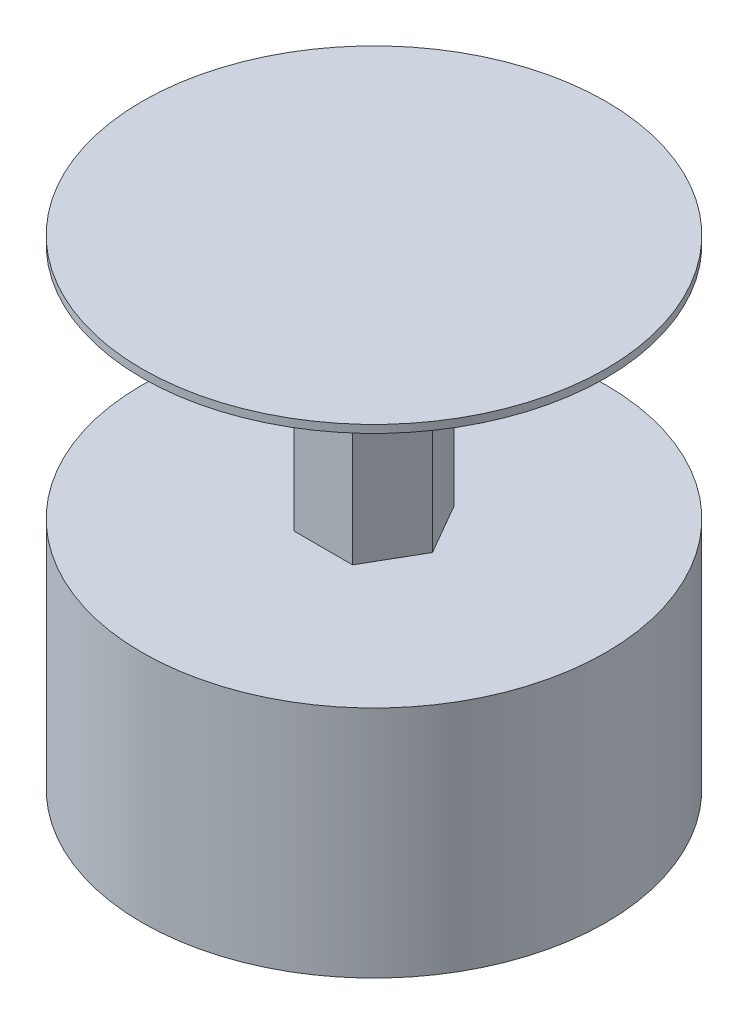
ISO-10303-21;
HEADER;
FILE_DESCRIPTION(('STEP AP214'),'2;1');
FILE_NAME('part.step','',(''),(''),'','','');
FILE_SCHEMA(('AUTOMOTIVE_DESIGN { 1 0 10303 214 1 1 1 1 }'));
ENDSEC;
DATA;
#1=APPLICATION_CONTEXT('core data for automotive mechanical design processes');
#2=APPLICATION_PROTOCOL_DEFINITION('international standard','automotive_design',2000,#1);
#3=PRODUCT_CONTEXT('',#1,'mechanical');
#4=PRODUCT('Part','Part','',(#3));
#5=PRODUCT_RELATED_PRODUCT_CATEGORY('part','',(#4));
#6=PRODUCT_DEFINITION_FORMATION('','',#4);
#7=PRODUCT_DEFINITION_CONTEXT('part definition',#1,'design');
#8=PRODUCT_DEFINITION('design','',#6,#7);
#9=PRODUCT_DEFINITION_SHAPE('','',#8);
#10=(LENGTH_UNIT() NAMED_UNIT(*) SI_UNIT(.MILLI.,.METRE.));
#11=(NAMED_UNIT(*) PLANE_ANGLE_UNIT() SI_UNIT($,.RADIAN.));
#12=(NAMED_UNIT(*) SI_UNIT($,.STERADIAN.) SOLID_ANGLE_UNIT());
#13=UNCERTAINTY_MEASURE_WITH_UNIT(LENGTH_MEASURE(1.E-05),#10,'distance_accuracy_value','');
#14=(GEOMETRIC_REPRESENTATION_CONTEXT(3) GLOBAL_UNCERTAINTY_ASSIGNED_CONTEXT((#13)) GLOBAL_UNIT_ASSIGNED_CONTEXT((#10,
#11,#12)) REPRESENTATION_CONTEXT('',''));
#15=CARTESIAN_POINT('',(0.,0.,0.));
#16=DIRECTION('',(0.,0.,1.));
#17=DIRECTION('',(1.,0.,0.));
#18=AXIS2_PLACEMENT_3D('',#15,#16,#17);
#19=CARTESIAN_POINT('',(0.,0.,0.));
#20=DIRECTION('',(0.,1.,0.));
#21=DIRECTION('',(0.,0.,1.));
#22=AXIS2_PLACEMENT_3D('',#19,#20,#21);
#23=PLANE('',#22);
#24=CARTESIAN_POINT('',(0.,0.,0.));
#25=DIRECTION('',(0.,1.,0.));
#26=DIRECTION('',(0.,0.,1.));
#27=AXIS2_PLACEMENT_3D('',#24,#25,#26);
#28=CIRCLE('',#27,297.32621214848);
#29=CARTESIAN_POINT('',(0.,0.,297.32621214848));
#30=VERTEX_POINT('',#29);
#31=EDGE_CURVE('E50',#30,#30,#28,.T.);
#32=ORIENTED_EDGE('',*,*,#31,.F.);
#33=EDGE_LOOP('',(#32));
#34=FACE_BOUND('',#33,.T.);
#35=DIRECTION('',(0.5,0.,0.866025403784439));
#36=VECTOR('',#35,1.);
#37=CARTESIAN_POINT('',(37.5,0.,-64.9519052838329));
#38=LINE('',#37,#36);
#39=CARTESIAN_POINT('',(37.5,0.,-64.9519052838329));
#40=VERTEX_POINT('',#39);
#41=CARTESIAN_POINT('',(75.,0.,0.));
#42=VERTEX_POINT('',#41);
#43=EDGE_CURVE('E62',#40,#42,#38,.T.);
#44=ORIENTED_EDGE('',*,*,#43,.F.);
#45=DIRECTION('',(1.,0.,0.));
#46=VECTOR('',#45,1.);
#47=CARTESIAN_POINT('',(-37.5,0.,-64.9519052838329));
#48=LINE('',#47,#46);
#49=CARTESIAN_POINT('',(-37.5,0.,-64.9519052838329));
#50=VERTEX_POINT('',#49);
#51=EDGE_CURVE('E66',#50,#40,#48,.T.);
#52=ORIENTED_EDGE('',*,*,#51,.F.);
#53=DIRECTION('',(0.5,0.,-0.866025403784439));
#54=VECTOR('',#53,1.);
#55=CARTESIAN_POINT('',(-75.,0.,0.));
#56=LINE('',#55,#54);
#57=CARTESIAN_POINT('',(-75.,0.,0.));
#58=VERTEX_POINT('',#57);
#59=EDGE_CURVE('E146',#58,#50,#56,.T.);
#60=ORIENTED_EDGE('',*,*,#59,.F.);
#61=DIRECTION('',(-0.5,0.,-0.866025403784439));
#62=VECTOR('',#61,1.);
#63=CARTESIAN_POINT('',(-37.5,0.,64.9519052838329));
#64=LINE('',#63,#62);
#65=CARTESIAN_POINT('',(-37.5,0.,64.9519052838329));
#66=VERTEX_POINT('',#65);
#67=EDGE_CURVE('E142',#66,#58,#64,.T.);
#68=ORIENTED_EDGE('',*,*,#67,.F.);
#69=DIRECTION('',(-1.,0.,0.));
#70=VECTOR('',#69,1.);
#71=CARTESIAN_POINT('',(37.5,0.,64.9519052838329));
#72=LINE('',#71,#70);
#73=CARTESIAN_POINT('',(37.5,0.,64.9519052838329));
#74=VERTEX_POINT('',#73);
#75=EDGE_CURVE('E138',#74,#66,#72,.T.);
#76=ORIENTED_EDGE('',*,*,#75,.F.);
#77=DIRECTION('',(-0.5,0.,0.866025403784439));
#78=VECTOR('',#77,1.);
#79=CARTESIAN_POINT('',(75.,0.,0.));
#80=LINE('',#79,#78);
#81=EDGE_CURVE('E133',#42,#74,#80,.T.);
#82=ORIENTED_EDGE('',*,*,#81,.F.);
#83=EDGE_LOOP('',(#44,#52,#60,#68,#76,#82));
#84=FACE_BOUND('',#83,.T.);
#85=ADVANCED_FACE('F46',(#34,#84),#23,.F.);
#86=CARTESIAN_POINT('',(0.,10.,0.));
#87=DIRECTION('',(0.,-1.,0.));
#88=DIRECTION('',(0.,0.,-1.));
#89=AXIS2_PLACEMENT_3D('',#86,#87,#88);
#90=CYLINDRICAL_SURFACE('',#89,297.32621214848);
#91=CARTESIAN_POINT('',(0.,10.,0.));
#92=DIRECTION('',(0.,1.,0.));
#93=DIRECTION('',(0.,0.,1.));
#94=AXIS2_PLACEMENT_3D('',#91,#92,#93);
#95=CIRCLE('',#94,297.32621214848);
#96=CARTESIAN_POINT('',(0.,10.,297.32621214848));
#97=VERTEX_POINT('',#96);
#98=EDGE_CURVE('E11',#97,#97,#95,.T.);
#99=ORIENTED_EDGE('',*,*,#98,.F.);
#100=EDGE_LOOP('',(#99));
#101=FACE_BOUND('',#100,.T.);
#102=ORIENTED_EDGE('',*,*,#31,.T.);
#103=EDGE_LOOP('',(#102));
#104=FACE_BOUND('',#103,.T.);
#105=ADVANCED_FACE('F48',(#101,#104),#90,.T.);
#106=CARTESIAN_POINT('',(0.,10.,0.));
#107=DIRECTION('',(0.,1.,0.));
#108=DIRECTION('',(0.,0.,1.));
#109=AXIS2_PLACEMENT_3D('',#106,#107,#108);
#110=PLANE('',#109);
#111=ORIENTED_EDGE('',*,*,#98,.T.);
#112=EDGE_LOOP('',(#111));
#113=FACE_BOUND('',#112,.T.);
#114=ADVANCED_FACE('F178',(#113),#110,.T.);
#115=CARTESIAN_POINT('',(37.5,-305.,-64.9519052838329));
#116=DIRECTION('',(-0.866025403784439,0.,0.5));
#117=DIRECTION('',(0.5,0.,0.866025403784439));
#118=AXIS2_PLACEMENT_3D('',#115,#116,#117);
#119=PLANE('',#118);
#120=ORIENTED_EDGE('',*,*,#43,.T.);
#121=DIRECTION('',(0.,1.,0.));
#122=VECTOR('',#121,1.);
#123=CARTESIAN_POINT('',(75.,-305.,0.));
#124=LINE('',#123,#122);
#125=CARTESIAN_POINT('',(75.,-305.,0.));
#126=VERTEX_POINT('',#125);
#127=EDGE_CURVE('E104',#126,#42,#124,.T.);
#128=ORIENTED_EDGE('',*,*,#127,.F.);
#129=DIRECTION('',(0.5,0.,0.866025403784439));
#130=VECTOR('',#129,1.);
#131=CARTESIAN_POINT('',(37.5,-305.,-64.9519052838329));
#132=LINE('',#131,#130);
#133=CARTESIAN_POINT('',(37.5,-305.,-64.9519052838329));
#134=VERTEX_POINT('',#133);
#135=EDGE_CURVE('E99',#134,#126,#132,.T.);
#136=ORIENTED_EDGE('',*,*,#135,.F.);
#137=DIRECTION('',(0.,1.,0.));
#138=VECTOR('',#137,1.);
#139=CARTESIAN_POINT('',(37.5,-305.,-64.9519052838329));
#140=LINE('',#139,#138);
#141=EDGE_CURVE('E102',#134,#40,#140,.T.);
#142=ORIENTED_EDGE('',*,*,#141,.T.);
#143=EDGE_LOOP('',(#120,#128,#136,#142));
#144=FACE_BOUND('',#143,.T.);
#145=ADVANCED_FACE('F101',(#144),#119,.F.);
#146=CARTESIAN_POINT('',(75.,-305.,0.));
#147=DIRECTION('',(-0.866025403784439,0.,-0.5));
#148=DIRECTION('',(-0.5,0.,0.866025403784439));
#149=AXIS2_PLACEMENT_3D('',#146,#147,#148);
#150=PLANE('',#149);
#151=ORIENTED_EDGE('',*,*,#81,.T.);
#152=DIRECTION('',(0.,1.,0.));
#153=VECTOR('',#152,1.);
#154=CARTESIAN_POINT('',(37.5,-305.,64.9519052838329));
#155=LINE('',#154,#153);
#156=CARTESIAN_POINT('',(37.5,-305.,64.9519052838329));
#157=VERTEX_POINT('',#156);
#158=EDGE_CURVE('E161',#157,#74,#155,.T.);
#159=ORIENTED_EDGE('',*,*,#158,.F.);
#160=DIRECTION('',(-0.5,0.,0.866025403784439));
#161=VECTOR('',#160,1.);
#162=CARTESIAN_POINT('',(75.,-305.,0.));
#163=LINE('',#162,#161);
#164=EDGE_CURVE('E109',#126,#157,#163,.T.);
#165=ORIENTED_EDGE('',*,*,#164,.F.);
#166=ORIENTED_EDGE('',*,*,#127,.T.);
#167=EDGE_LOOP('',(#151,#159,#165,#166));
#168=FACE_BOUND('',#167,.T.);
#169=ADVANCED_FACE('F184',(#168),#150,.F.);
#170=CARTESIAN_POINT('',(37.5,-305.,64.9519052838329));
#171=DIRECTION('',(0.,0.,-1.));
#172=DIRECTION('',(-1.,0.,0.));
#173=AXIS2_PLACEMENT_3D('',#170,#171,#172);
#174=PLANE('',#173);
#175=ORIENTED_EDGE('',*,*,#75,.T.);
#176=DIRECTION('',(0.,1.,0.));
#177=VECTOR('',#176,1.);
#178=CARTESIAN_POINT('',(-37.5,-305.,64.9519052838329));
#179=LINE('',#178,#177);
#180=CARTESIAN_POINT('',(-37.5,-305.,64.9519052838329));
#181=VERTEX_POINT('',#180);
#182=EDGE_CURVE('E157',#181,#66,#179,.T.);
#183=ORIENTED_EDGE('',*,*,#182,.F.);
#184=DIRECTION('',(-1.,0.,0.));
#185=VECTOR('',#184,1.);
#186=CARTESIAN_POINT('',(37.5,-305.,64.9519052838329));
#187=LINE('',#186,#185);
#188=EDGE_CURVE('E288',#157,#181,#187,.T.);
#189=ORIENTED_EDGE('',*,*,#188,.F.);
#190=ORIENTED_EDGE('',*,*,#158,.T.);
#191=EDGE_LOOP('',(#175,#183,#189,#190));
#192=FACE_BOUND('',#191,.T.);
#193=ADVANCED_FACE('F187',(#192),#174,.F.);
#194=CARTESIAN_POINT('',(-37.5,-305.,64.9519052838329));
#195=DIRECTION('',(0.866025403784439,0.,-0.5));
#196=DIRECTION('',(-0.5,0.,-0.866025403784439));
#197=AXIS2_PLACEMENT_3D('',#194,#195,#196);
#198=PLANE('',#197);
#199=ORIENTED_EDGE('',*,*,#67,.T.);
#200=DIRECTION('',(0.,1.,0.));
#201=VECTOR('',#200,1.);
#202=CARTESIAN_POINT('',(-75.,-305.,0.));
#203=LINE('',#202,#201);
#204=CARTESIAN_POINT('',(-75.,-305.,0.));
#205=VERTEX_POINT('',#204);
#206=EDGE_CURVE('E153',#205,#58,#203,.T.);
#207=ORIENTED_EDGE('',*,*,#206,.F.);
#208=DIRECTION('',(-0.5,0.,-0.866025403784439));
#209=VECTOR('',#208,1.);
#210=CARTESIAN_POINT('',(-37.5,-305.,64.9519052838329));
#211=LINE('',#210,#209);
#212=EDGE_CURVE('E127',#181,#205,#211,.T.);
#213=ORIENTED_EDGE('',*,*,#212,.F.);
#214=ORIENTED_EDGE('',*,*,#182,.T.);
#215=EDGE_LOOP('',(#199,#207,#213,#214));
#216=FACE_BOUND('',#215,.T.);
#217=ADVANCED_FACE('F190',(#216),#198,.F.);
#218=CARTESIAN_POINT('',(-75.,-305.,0.));
#219=DIRECTION('',(0.866025403784439,0.,0.5));
#220=DIRECTION('',(0.5,0.,-0.866025403784439));
#221=AXIS2_PLACEMENT_3D('',#218,#219,#220);
#222=PLANE('',#221);
#223=ORIENTED_EDGE('',*,*,#59,.T.);
#224=DIRECTION('',(0.,1.,0.));
#225=VECTOR('',#224,1.);
#226=CARTESIAN_POINT('',(-37.5,-305.,-64.9519052838329));
#227=LINE('',#226,#225);
#228=CARTESIAN_POINT('',(-37.5,-305.,-64.9519052838329));
#229=VERTEX_POINT('',#228);
#230=EDGE_CURVE('E118',#229,#50,#227,.T.);
#231=ORIENTED_EDGE('',*,*,#230,.F.);
#232=DIRECTION('',(0.5,0.,-0.866025403784439));
#233=VECTOR('',#232,1.);
#234=CARTESIAN_POINT('',(-75.,-305.,0.));
#235=LINE('',#234,#233);
#236=EDGE_CURVE('E123',#205,#229,#235,.T.);
#237=ORIENTED_EDGE('',*,*,#236,.F.);
#238=ORIENTED_EDGE('',*,*,#206,.T.);
#239=EDGE_LOOP('',(#223,#231,#237,#238));
#240=FACE_BOUND('',#239,.T.);
#241=ADVANCED_FACE('F194',(#240),#222,.F.);
#242=CARTESIAN_POINT('',(-37.5,-305.,-64.9519052838329));
#243=DIRECTION('',(0.,0.,1.));
#244=DIRECTION('',(1.,0.,0.));
#245=AXIS2_PLACEMENT_3D('',#242,#243,#244);
#246=PLANE('',#245);
#247=ORIENTED_EDGE('',*,*,#51,.T.);
#248=ORIENTED_EDGE('',*,*,#141,.F.);
#249=DIRECTION('',(1.,0.,0.));
#250=VECTOR('',#249,1.);
#251=CARTESIAN_POINT('',(-37.5,-305.,-64.9519052838329));
#252=LINE('',#251,#250);
#253=EDGE_CURVE('E115',#229,#134,#252,.T.);
#254=ORIENTED_EDGE('',*,*,#253,.F.);
#255=ORIENTED_EDGE('',*,*,#230,.T.);
#256=EDGE_LOOP('',(#247,#248,#254,#255));
#257=FACE_BOUND('',#256,.T.);
#258=ADVANCED_FACE('F113',(#257),#246,.F.);
#259=CARTESIAN_POINT('',(0.,-305.,0.));
#260=DIRECTION('',(0.,-1.,0.));
#261=DIRECTION('',(0.,0.,-1.));
#262=AXIS2_PLACEMENT_3D('',#259,#260,#261);
#263=PLANE('',#262);
#264=CARTESIAN_POINT('',(0.,-305.,0.));
#265=DIRECTION('',(0.,-1.,0.));
#266=DIRECTION('',(0.,0.,-1.));
#267=AXIS2_PLACEMENT_3D('',#264,#265,#266);
#268=CIRCLE('',#267,297.32621214848);
#269=CARTESIAN_POINT('',(0.,-305.,-297.32621214848));
#270=VERTEX_POINT('',#269);
#271=EDGE_CURVE('E272',#270,#270,#268,.T.);
#272=ORIENTED_EDGE('',*,*,#271,.F.);
#273=EDGE_LOOP('',(#272));
#274=FACE_BOUND('',#273,.T.);
#275=ORIENTED_EDGE('',*,*,#253,.T.);
#276=ORIENTED_EDGE('',*,*,#135,.T.);
#277=ORIENTED_EDGE('',*,*,#164,.T.);
#278=ORIENTED_EDGE('',*,*,#188,.T.);
#279=ORIENTED_EDGE('',*,*,#212,.T.);
#280=ORIENTED_EDGE('',*,*,#236,.T.);
#281=EDGE_LOOP('',(#275,#276,#277,#278,#279,#280));
#282=FACE_BOUND('',#281,.T.);
#283=ADVANCED_FACE('F120',(#274,#282),#263,.F.);
#284=CARTESIAN_POINT('',(0.,-605.,0.));
#285=DIRECTION('',(0.,1.,0.));
#286=DIRECTION('',(0.,0.,1.));
#287=AXIS2_PLACEMENT_3D('',#284,#285,#286);
#288=CYLINDRICAL_SURFACE('',#287,297.32621214848);
#289=CARTESIAN_POINT('',(0.,-605.,0.));
#290=DIRECTION('',(0.,-1.,0.));
#291=DIRECTION('',(0.,0.,-1.));
#292=AXIS2_PLACEMENT_3D('',#289,#290,#291);
#293=CIRCLE('',#292,297.32621214848);
#294=CARTESIAN_POINT('',(0.,-605.,-297.32621214848));
#295=VERTEX_POINT('',#294);
#296=EDGE_CURVE('E134',#295,#295,#293,.T.);
#297=ORIENTED_EDGE('',*,*,#296,.F.);
#298=EDGE_LOOP('',(#297));
#299=FACE_BOUND('',#298,.T.);
#300=ORIENTED_EDGE('',*,*,#271,.T.);
#301=EDGE_LOOP('',(#300));
#302=FACE_BOUND('',#301,.T.);
#303=ADVANCED_FACE('F201',(#299,#302),#288,.T.);
#304=CARTESIAN_POINT('',(0.,-605.,0.));
#305=DIRECTION('',(0.,-1.,0.));
#306=DIRECTION('',(0.,0.,-1.));
#307=AXIS2_PLACEMENT_3D('',#304,#305,#306);
#308=PLANE('',#307);
#309=CARTESIAN_POINT('',(0.,-605.,259.826212148481));
#310=DIRECTION('',(0.,-1.,0.));
#311=DIRECTION('',(0.,0.,-1.));
#312=AXIS2_PLACEMENT_3D('',#309,#310,#311);
#313=CIRCLE('',#312,5.);
#314=CARTESIAN_POINT('',(0.,-605.,254.82621214848));
#315=VERTEX_POINT('',#314);
#316=EDGE_CURVE('E250',#315,#315,#313,.T.);
#317=ORIENTED_EDGE('',*,*,#316,.F.);
#318=EDGE_LOOP('',(#317));
#319=FACE_BOUND('',#318,.T.);
#320=CARTESIAN_POINT('',(2.22044604925031E-13,-605.,-259.826212148481));
#321=DIRECTION('',(0.,-1.,0.));
#322=DIRECTION('',(0.,0.,1.));
#323=AXIS2_PLACEMENT_3D('',#320,#321,#322);
#324=CIRCLE('',#323,5.);
#325=CARTESIAN_POINT('',(2.22044604925031E-13,-605.,-254.82621214848));
#326=VERTEX_POINT('',#325);
#327=EDGE_CURVE('E258',#326,#326,#324,.T.);
#328=ORIENTED_EDGE('',*,*,#327,.F.);
#329=EDGE_LOOP('',(#328));
#330=FACE_BOUND('',#329,.T.);
#331=CARTESIAN_POINT('',(150.,-605.,0.));
#332=DIRECTION('',(0.,-1.,0.));
#333=DIRECTION('',(0.,0.,-1.));
#334=AXIS2_PLACEMENT_3D('',#331,#332,#333);
#335=CIRCLE('',#334,4.99999999999999);
#336=CARTESIAN_POINT('',(150.,-605.,-4.99999999999999));
#337=VERTEX_POINT('',#336);
#338=EDGE_CURVE('E273',#337,#337,#335,.T.);
#339=ORIENTED_EDGE('',*,*,#338,.F.);
#340=EDGE_LOOP('',(#339));
#341=FACE_BOUND('',#340,.T.);
#342=CARTESIAN_POINT('',(-150.,-605.,-2.22044604925031E-13));
#343=DIRECTION('',(0.,-1.,0.));
#344=DIRECTION('',(0.,0.,1.));
#345=AXIS2_PLACEMENT_3D('',#342,#343,#344);
#346=CIRCLE('',#345,4.99999999999999);
#347=CARTESIAN_POINT('',(-150.,-605.,4.99999999999977));
#348=VERTEX_POINT('',#347);
#349=EDGE_CURVE('E255',#348,#348,#346,.T.);
#350=ORIENTED_EDGE('',*,*,#349,.F.);
#351=EDGE_LOOP('',(#350));
#352=FACE_BOUND('',#351,.T.);
#353=ORIENTED_EDGE('',*,*,#296,.T.);
#354=EDGE_LOOP('',(#353));
#355=FACE_BOUND('',#354,.T.);
#356=ADVANCED_FACE('F204',(#319,#330,#341,#352,#355),#308,.T.);
#357=CARTESIAN_POINT('',(-150.,-595.,-2.22044604925031E-13));
#358=DIRECTION('',(0.,-1.,0.));
#359=DIRECTION('',(0.,0.,-1.));
#360=AXIS2_PLACEMENT_3D('',#357,#358,#359);
#361=CYLINDRICAL_SURFACE('',#360,4.99999999999999);
#362=CARTESIAN_POINT('',(-150.,-595.,-2.22044604925031E-13));
#363=DIRECTION('',(0.,-1.,0.));
#364=DIRECTION('',(0.,0.,1.));
#365=AXIS2_PLACEMENT_3D('',#362,#363,#364);
#366=CIRCLE('',#365,4.99999999999999);
#367=CARTESIAN_POINT('',(-150.,-595.,4.99999999999977));
#368=VERTEX_POINT('',#367);
#369=EDGE_CURVE('E249',#368,#368,#366,.T.);
#370=ORIENTED_EDGE('',*,*,#369,.F.);
#371=EDGE_LOOP('',(#370));
#372=FACE_BOUND('',#371,.T.);
#373=ORIENTED_EDGE('',*,*,#349,.T.);
#374=EDGE_LOOP('',(#373));
#375=FACE_BOUND('',#374,.T.);
#376=ADVANCED_FACE('F211',(#372,#375),#361,.F.);
#377=CARTESIAN_POINT('',(-150.,-595.,-2.22044604925031E-13));
#378=DIRECTION('',(0.,1.,0.));
#379=DIRECTION('',(0.,0.,1.));
#380=AXIS2_PLACEMENT_3D('',#377,#378,#379);
#381=PLANE('',#380);
#382=ORIENTED_EDGE('',*,*,#369,.T.);
#383=EDGE_LOOP('',(#382));
#384=FACE_BOUND('',#383,.T.);
#385=ADVANCED_FACE('F213',(#384),#381,.F.);
#386=CARTESIAN_POINT('',(150.,-595.,0.));
#387=DIRECTION('',(0.,-1.,0.));
#388=DIRECTION('',(0.,0.,-1.));
#389=AXIS2_PLACEMENT_3D('',#386,#387,#388);
#390=CYLINDRICAL_SURFACE('',#389,4.99999999999999);
#391=CARTESIAN_POINT('',(150.,-595.,0.));
#392=DIRECTION('',(0.,-1.,0.));
#393=DIRECTION('',(0.,0.,-1.));
#394=AXIS2_PLACEMENT_3D('',#391,#392,#393);
#395=CIRCLE('',#394,4.99999999999999);
#396=CARTESIAN_POINT('',(150.,-595.,-4.99999999999999));
#397=VERTEX_POINT('',#396);
#398=EDGE_CURVE('E268',#397,#397,#395,.T.);
#399=ORIENTED_EDGE('',*,*,#398,.F.);
#400=EDGE_LOOP('',(#399));
#401=FACE_BOUND('',#400,.T.);
#402=ORIENTED_EDGE('',*,*,#338,.T.);
#403=EDGE_LOOP('',(#402));
#404=FACE_BOUND('',#403,.T.);
#405=ADVANCED_FACE('F216',(#401,#404),#390,.F.);
#406=CARTESIAN_POINT('',(150.,-595.,0.));
#407=DIRECTION('',(0.,-1.,0.));
#408=DIRECTION('',(0.,0.,-1.));
#409=AXIS2_PLACEMENT_3D('',#406,#407,#408);
#410=PLANE('',#409);
#411=ORIENTED_EDGE('',*,*,#398,.T.);
#412=EDGE_LOOP('',(#411));
#413=FACE_BOUND('',#412,.T.);
#414=ADVANCED_FACE('F223',(#413),#410,.T.);
#415=CARTESIAN_POINT('',(2.22044604925031E-13,-595.,-259.826212148481));
#416=DIRECTION('',(0.,-1.,0.));
#417=DIRECTION('',(0.,0.,-1.));
#418=AXIS2_PLACEMENT_3D('',#415,#416,#417);
#419=CYLINDRICAL_SURFACE('',#418,5.);
#420=CARTESIAN_POINT('',(2.22044604925031E-13,-595.,-259.826212148481));
#421=DIRECTION('',(0.,-1.,0.));
#422=DIRECTION('',(0.,0.,1.));
#423=AXIS2_PLACEMENT_3D('',#420,#421,#422);
#424=CIRCLE('',#423,5.);
#425=CARTESIAN_POINT('',(2.22044604925031E-13,-595.,-254.82621214848));
#426=VERTEX_POINT('',#425);
#427=EDGE_CURVE('E264',#426,#426,#424,.T.);
#428=ORIENTED_EDGE('',*,*,#427,.F.);
#429=EDGE_LOOP('',(#428));
#430=FACE_BOUND('',#429,.T.);
#431=ORIENTED_EDGE('',*,*,#327,.T.);
#432=EDGE_LOOP('',(#431));
#433=FACE_BOUND('',#432,.T.);
#434=ADVANCED_FACE('F227',(#430,#433),#419,.F.);
#435=CARTESIAN_POINT('',(2.22044604925031E-13,-595.,-259.826212148481));
#436=DIRECTION('',(0.,1.,0.));
#437=DIRECTION('',(0.,0.,1.));
#438=AXIS2_PLACEMENT_3D('',#435,#436,#437);
#439=PLANE('',#438);
#440=ORIENTED_EDGE('',*,*,#427,.T.);
#441=EDGE_LOOP('',(#440));
#442=FACE_BOUND('',#441,.T.);
#443=ADVANCED_FACE('F229',(#442),#439,.F.);
#444=CARTESIAN_POINT('',(0.,-595.,259.826212148481));
#445=DIRECTION('',(0.,-1.,0.));
#446=DIRECTION('',(0.,0.,-1.));
#447=AXIS2_PLACEMENT_3D('',#444,#445,#446);
#448=CYLINDRICAL_SURFACE('',#447,5.);
#449=CARTESIAN_POINT('',(0.,-595.,259.826212148481));
#450=DIRECTION('',(0.,-1.,0.));
#451=DIRECTION('',(0.,0.,-1.));
#452=AXIS2_PLACEMENT_3D('',#449,#450,#451);
#453=CIRCLE('',#452,5.);
#454=CARTESIAN_POINT('',(0.,-595.,254.82621214848));
#455=VERTEX_POINT('',#454);
#456=EDGE_CURVE('E247',#455,#455,#453,.T.);
#457=ORIENTED_EDGE('',*,*,#456,.F.);
#458=EDGE_LOOP('',(#457));
#459=FACE_BOUND('',#458,.T.);
#460=ORIENTED_EDGE('',*,*,#316,.T.);
#461=EDGE_LOOP('',(#460));
#462=FACE_BOUND('',#461,.T.);
#463=ADVANCED_FACE('F232',(#459,#462),#448,.F.);
#464=CARTESIAN_POINT('',(0.,-595.,259.826212148481));
#465=DIRECTION('',(0.,-1.,0.));
#466=DIRECTION('',(0.,0.,-1.));
#467=AXIS2_PLACEMENT_3D('',#464,#465,#466);
#468=PLANE('',#467);
#469=ORIENTED_EDGE('',*,*,#456,.T.);
#470=EDGE_LOOP('',(#469));
#471=FACE_BOUND('',#470,.T.);
#472=ADVANCED_FACE('F239',(#471),#468,.T.);
#473=CLOSED_SHELL('',(#85,#105,#114,#145,#169,#193,#217,#241,#258,#283,#303,#356,#376,#385,#405,
#414,#434,#443,#463,#472));
#474=MANIFOLD_SOLID_BREP('B2',#473);
#475=ADVANCED_BREP_SHAPE_REPRESENTATION('',(#18,#474),#14);
#476=SHAPE_DEFINITION_REPRESENTATION(#9,#475);
ENDSEC;
END-ISO-10303-21;
